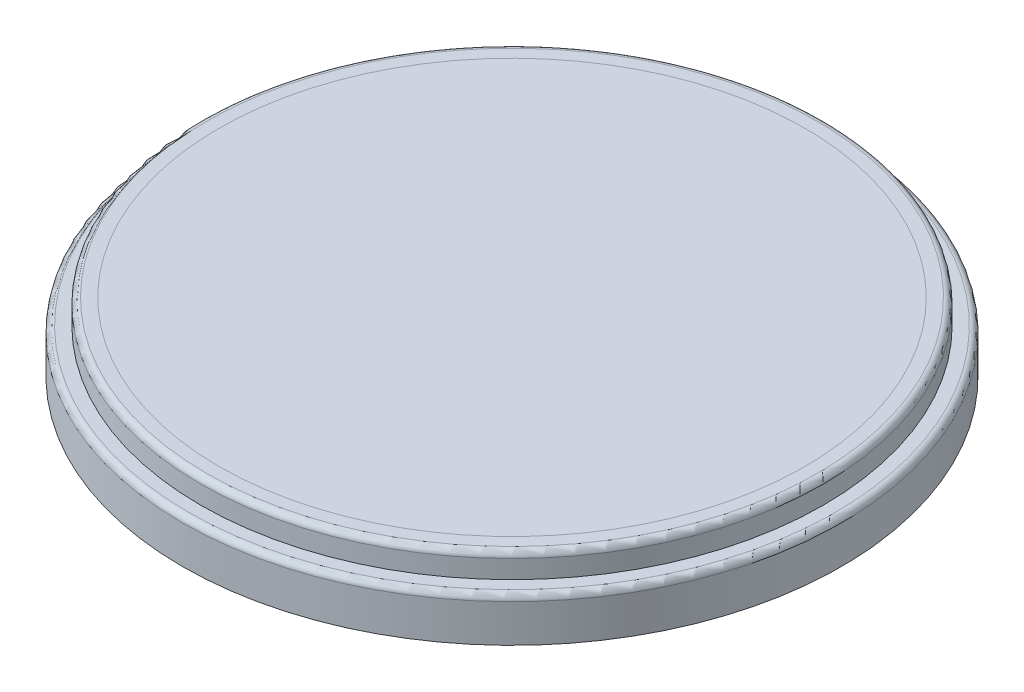
ISO-10303-21;
HEADER;
FILE_DESCRIPTION(('STEP AP214'),'2;1');
FILE_NAME('part.step','',(''),(''),'','','');
FILE_SCHEMA(('AUTOMOTIVE_DESIGN { 1 0 10303 214 1 1 1 1 }'));
ENDSEC;
DATA;
#1=APPLICATION_CONTEXT('core data for automotive mechanical design processes');
#2=APPLICATION_PROTOCOL_DEFINITION('international standard','automotive_design',2000,#1);
#3=PRODUCT_CONTEXT('',#1,'mechanical');
#4=PRODUCT('Part','Part','',(#3));
#5=PRODUCT_RELATED_PRODUCT_CATEGORY('part','',(#4));
#6=PRODUCT_DEFINITION_FORMATION('','',#4);
#7=PRODUCT_DEFINITION_CONTEXT('part definition',#1,'design');
#8=PRODUCT_DEFINITION('design','',#6,#7);
#9=PRODUCT_DEFINITION_SHAPE('','',#8);
#10=(LENGTH_UNIT() NAMED_UNIT(*) SI_UNIT(.MILLI.,.METRE.));
#11=(NAMED_UNIT(*) PLANE_ANGLE_UNIT() SI_UNIT($,.RADIAN.));
#12=(NAMED_UNIT(*) SI_UNIT($,.STERADIAN.) SOLID_ANGLE_UNIT());
#13=UNCERTAINTY_MEASURE_WITH_UNIT(LENGTH_MEASURE(1.E-05),#10,'distance_accuracy_value','');
#14=(GEOMETRIC_REPRESENTATION_CONTEXT(3) GLOBAL_UNCERTAINTY_ASSIGNED_CONTEXT((#13)) GLOBAL_UNIT_ASSIGNED_CONTEXT((#10,
#11,#12)) REPRESENTATION_CONTEXT('',''));
#15=CARTESIAN_POINT('',(0.,0.,0.));
#16=DIRECTION('',(0.,0.,1.));
#17=DIRECTION('',(1.,0.,0.));
#18=AXIS2_PLACEMENT_3D('',#15,#16,#17);
#19=CARTESIAN_POINT('',(0.,4.6,0.));
#20=DIRECTION('',(0.,1.,0.));
#21=DIRECTION('',(0.,0.,1.));
#22=AXIS2_PLACEMENT_3D('',#19,#20,#21);
#23=CYLINDRICAL_SURFACE('',#22,24.);
#24=CARTESIAN_POINT('',(0.,4.6,0.));
#25=DIRECTION('',(0.,1.,0.));
#26=DIRECTION('',(0.,0.,1.));
#27=AXIS2_PLACEMENT_3D('',#24,#25,#26);
#28=CIRCLE('',#27,24.);
#29=CARTESIAN_POINT('',(0.,4.6,24.));
#30=VERTEX_POINT('',#29);
#31=EDGE_CURVE('E11',#30,#30,#28,.T.);
#32=ORIENTED_EDGE('',*,*,#31,.T.);
#33=EDGE_LOOP('',(#32));
#34=FACE_BOUND('',#33,.T.);
#35=CARTESIAN_POINT('',(0.,5.6,0.));
#36=DIRECTION('',(0.,1.,0.));
#37=DIRECTION('',(0.,0.,1.));
#38=AXIS2_PLACEMENT_3D('',#35,#36,#37);
#39=CIRCLE('',#38,24.);
#40=CARTESIAN_POINT('',(0.,5.6,24.));
#41=VERTEX_POINT('',#40);
#42=EDGE_CURVE('E48',#41,#41,#39,.T.);
#43=ORIENTED_EDGE('',*,*,#42,.F.);
#44=EDGE_LOOP('',(#43));
#45=FACE_BOUND('',#44,.T.);
#46=ADVANCED_FACE('F45',(#34,#45),#23,.T.);
#47=CARTESIAN_POINT('',(0.,4.6,0.));
#48=DIRECTION('',(0.,1.,0.));
#49=DIRECTION('',(0.,0.,1.));
#50=AXIS2_PLACEMENT_3D('',#47,#48,#49);
#51=PLANE('',#50);
#52=ORIENTED_EDGE('',*,*,#31,.F.);
#53=EDGE_LOOP('',(#52));
#54=FACE_BOUND('',#53,.T.);
#55=ADVANCED_FACE('F60',(#54),#51,.F.);
#56=CARTESIAN_POINT('',(0.,5.6,0.));
#57=DIRECTION('',(0.,1.,0.));
#58=DIRECTION('',(0.,0.,1.));
#59=AXIS2_PLACEMENT_3D('',#56,#57,#58);
#60=PLANE('',#59);
#61=ORIENTED_EDGE('',*,*,#42,.T.);
#62=EDGE_LOOP('',(#61));
#63=FACE_BOUND('',#62,.T.);
#64=ADVANCED_FACE('F57',(#63),#60,.T.);
#65=CLOSED_SHELL('',(#46,#55,#64));
#66=MANIFOLD_SOLID_BREP('B2',#65);
#67=CARTESIAN_POINT('',(0.,5.6,0.));
#68=DIRECTION('',(0.,1.,0.));
#69=DIRECTION('',(0.,0.,1.));
#70=AXIS2_PLACEMENT_3D('',#67,#68,#69);
#71=PLANE('',#70);
#72=CARTESIAN_POINT('',(0.,5.6,0.));
#73=DIRECTION('',(0.,1.,0.));
#74=DIRECTION('',(0.,0.,1.));
#75=AXIS2_PLACEMENT_3D('',#72,#73,#74);
#76=CIRCLE('',#75,25.);
#77=CARTESIAN_POINT('',(0.,5.6,25.));
#78=VERTEX_POINT('',#77);
#79=EDGE_CURVE('E100',#78,#78,#76,.T.);
#80=ORIENTED_EDGE('',*,*,#79,.T.);
#81=EDGE_LOOP('',(#80));
#82=FACE_BOUND('',#81,.T.);
#83=CARTESIAN_POINT('',(0.,5.6,0.));
#84=DIRECTION('',(0.,1.,0.));
#85=DIRECTION('',(0.,0.,1.));
#86=AXIS2_PLACEMENT_3D('',#83,#84,#85);
#87=CIRCLE('',#86,24.);
#88=CARTESIAN_POINT('',(0.,5.6,24.));
#89=VERTEX_POINT('',#88);
#90=EDGE_CURVE('E116',#89,#89,#87,.T.);
#91=ORIENTED_EDGE('',*,*,#90,.F.);
#92=EDGE_LOOP('',(#91));
#93=FACE_BOUND('',#92,.T.);
#94=ADVANCED_FACE('F93',(#82,#93),#71,.T.);
#95=CARTESIAN_POINT('',(0.,3.6,0.));
#96=DIRECTION('',(0.,1.,0.));
#97=DIRECTION('',(0.,0.,1.));
#98=AXIS2_PLACEMENT_3D('',#95,#96,#97);
#99=PLANE('',#98);
#100=CARTESIAN_POINT('',(0.,3.6,0.));
#101=DIRECTION('',(0.,1.,0.));
#102=DIRECTION('',(0.,0.,1.));
#103=AXIS2_PLACEMENT_3D('',#100,#101,#102);
#104=CIRCLE('',#103,24.5);
#105=CARTESIAN_POINT('',(0.,3.6,24.5));
#106=VERTEX_POINT('',#105);
#107=EDGE_CURVE('E108',#106,#106,#104,.T.);
#108=ORIENTED_EDGE('',*,*,#107,.T.);
#109=EDGE_LOOP('',(#108));
#110=FACE_BOUND('',#109,.T.);
#111=CARTESIAN_POINT('',(0.,3.6,0.));
#112=DIRECTION('',(0.,1.,0.));
#113=DIRECTION('',(0.,0.,1.));
#114=AXIS2_PLACEMENT_3D('',#111,#112,#113);
#115=CIRCLE('',#114,25.5);
#116=CARTESIAN_POINT('',(0.,3.6,25.5));
#117=VERTEX_POINT('',#116);
#118=EDGE_CURVE('E113',#117,#117,#115,.T.);
#119=ORIENTED_EDGE('',*,*,#118,.F.);
#120=EDGE_LOOP('',(#119));
#121=FACE_BOUND('',#120,.T.);
#122=ADVANCED_FACE('F123',(#110,#121),#99,.F.);
#123=CARTESIAN_POINT('',(0.,5.6,0.));
#124=DIRECTION('',(0.,-1.,0.));
#125=DIRECTION('',(0.,0.,-1.));
#126=AXIS2_PLACEMENT_3D('',#123,#124,#125);
#127=CYLINDRICAL_SURFACE('',#126,25.5);
#128=CARTESIAN_POINT('',(0.,5.1,0.));
#129=DIRECTION('',(0.,1.,0.));
#130=DIRECTION('',(0.,0.,1.));
#131=AXIS2_PLACEMENT_3D('',#128,#129,#130);
#132=CIRCLE('',#131,25.5);
#133=CARTESIAN_POINT('',(0.,5.1,25.5));
#134=VERTEX_POINT('',#133);
#135=EDGE_CURVE('E44',#134,#134,#132,.F.);
#136=ORIENTED_EDGE('',*,*,#135,.T.);
#137=EDGE_LOOP('',(#136));
#138=FACE_BOUND('',#137,.T.);
#139=ORIENTED_EDGE('',*,*,#118,.T.);
#140=EDGE_LOOP('',(#139));
#141=FACE_BOUND('',#140,.T.);
#142=ADVANCED_FACE('F128',(#138,#141),#127,.T.);
#143=CARTESIAN_POINT('',(0.,5.6,0.));
#144=DIRECTION('',(0.,-1.,0.));
#145=DIRECTION('',(0.,0.,-1.));
#146=AXIS2_PLACEMENT_3D('',#143,#144,#145);
#147=CYLINDRICAL_SURFACE('',#146,24.);
#148=CARTESIAN_POINT('',(0.,4.1,0.));
#149=DIRECTION('',(0.,1.,0.));
#150=DIRECTION('',(0.,0.,1.));
#151=AXIS2_PLACEMENT_3D('',#148,#149,#150);
#152=CIRCLE('',#151,24.);
#153=CARTESIAN_POINT('',(0.,4.1,24.));
#154=VERTEX_POINT('',#153);
#155=EDGE_CURVE('E104',#154,#154,#152,.F.);
#156=ORIENTED_EDGE('',*,*,#155,.T.);
#157=EDGE_LOOP('',(#156));
#158=FACE_BOUND('',#157,.T.);
#159=ORIENTED_EDGE('',*,*,#90,.T.);
#160=EDGE_LOOP('',(#159));
#161=FACE_BOUND('',#160,.T.);
#162=ADVANCED_FACE('F120',(#158,#161),#147,.F.);
#163=CARTESIAN_POINT('',(0.,4.1,0.));
#164=DIRECTION('',(0.,1.,0.));
#165=DIRECTION('',(0.,0.,1.));
#166=AXIS2_PLACEMENT_3D('',#163,#164,#165);
#167=TOROIDAL_SURFACE('',#166,24.5,0.5);
#168=ORIENTED_EDGE('',*,*,#155,.F.);
#169=EDGE_LOOP('',(#168));
#170=FACE_BOUND('',#169,.T.);
#171=ORIENTED_EDGE('',*,*,#107,.F.);
#172=EDGE_LOOP('',(#171));
#173=FACE_BOUND('',#172,.T.);
#174=ADVANCED_FACE('F134',(#170,#173),#167,.T.);
#175=CARTESIAN_POINT('',(0.,5.1,0.));
#176=DIRECTION('',(0.,1.,0.));
#177=DIRECTION('',(0.,0.,1.));
#178=AXIS2_PLACEMENT_3D('',#175,#176,#177);
#179=TOROIDAL_SURFACE('',#178,25.,0.5);
#180=ORIENTED_EDGE('',*,*,#135,.F.);
#181=EDGE_LOOP('',(#180));
#182=FACE_BOUND('',#181,.T.);
#183=ORIENTED_EDGE('',*,*,#79,.F.);
#184=EDGE_LOOP('',(#183));
#185=FACE_BOUND('',#184,.T.);
#186=ADVANCED_FACE('F95',(#182,#185),#179,.T.);
#187=CLOSED_SHELL('',(#94,#122,#142,#162,#174,#186));
#188=MANIFOLD_SOLID_BREP('B6',#187);
#189=CARTESIAN_POINT('',(0.,3.6,0.));
#190=DIRECTION('',(0.,1.,0.));
#191=DIRECTION('',(0.,0.,1.));
#192=AXIS2_PLACEMENT_3D('',#189,#190,#191);
#193=PLANE('',#192);
#194=CARTESIAN_POINT('',(0.,3.6,0.));
#195=DIRECTION('',(0.,1.,0.));
#196=DIRECTION('',(0.,0.,1.));
#197=AXIS2_PLACEMENT_3D('',#194,#195,#196);
#198=CIRCLE('',#197,26.5);
#199=CARTESIAN_POINT('',(0.,3.6,26.5));
#200=VERTEX_POINT('',#199);
#201=EDGE_CURVE('E191',#200,#200,#198,.T.);
#202=ORIENTED_EDGE('',*,*,#201,.T.);
#203=EDGE_LOOP('',(#202));
#204=FACE_BOUND('',#203,.T.);
#205=CARTESIAN_POINT('',(0.,3.6,0.));
#206=DIRECTION('',(0.,1.,0.));
#207=DIRECTION('',(0.,0.,1.));
#208=AXIS2_PLACEMENT_3D('',#205,#206,#207);
#209=CIRCLE('',#208,25.5);
#210=CARTESIAN_POINT('',(0.,3.6,25.5));
#211=VERTEX_POINT('',#210);
#212=EDGE_CURVE('E199',#211,#211,#209,.T.);
#213=ORIENTED_EDGE('',*,*,#212,.F.);
#214=EDGE_LOOP('',(#213));
#215=FACE_BOUND('',#214,.T.);
#216=ADVANCED_FACE('F184',(#204,#215),#193,.T.);
#217=CARTESIAN_POINT('',(0.,0.,0.));
#218=DIRECTION('',(0.,1.,0.));
#219=DIRECTION('',(0.,0.,1.));
#220=AXIS2_PLACEMENT_3D('',#217,#218,#219);
#221=PLANE('',#220);
#222=CARTESIAN_POINT('',(0.,0.,0.));
#223=DIRECTION('',(0.,1.,0.));
#224=DIRECTION('',(0.,0.,1.));
#225=AXIS2_PLACEMENT_3D('',#222,#223,#224);
#226=CIRCLE('',#225,27.);
#227=CARTESIAN_POINT('',(0.,0.,27.));
#228=VERTEX_POINT('',#227);
#229=EDGE_CURVE('E195',#228,#228,#226,.T.);
#230=ORIENTED_EDGE('',*,*,#229,.F.);
#231=EDGE_LOOP('',(#230));
#232=FACE_BOUND('',#231,.T.);
#233=CARTESIAN_POINT('',(0.,0.,0.));
#234=DIRECTION('',(0.,1.,0.));
#235=DIRECTION('',(0.,0.,1.));
#236=AXIS2_PLACEMENT_3D('',#233,#234,#235);
#237=CIRCLE('',#236,25.5);
#238=CARTESIAN_POINT('',(0.,0.,25.5));
#239=VERTEX_POINT('',#238);
#240=EDGE_CURVE('E202',#239,#239,#237,.T.);
#241=ORIENTED_EDGE('',*,*,#240,.T.);
#242=EDGE_LOOP('',(#241));
#243=FACE_BOUND('',#242,.T.);
#244=ADVANCED_FACE('F212',(#232,#243),#221,.F.);
#245=CARTESIAN_POINT('',(0.,3.6,0.));
#246=DIRECTION('',(0.,-1.,0.));
#247=DIRECTION('',(0.,0.,-1.));
#248=AXIS2_PLACEMENT_3D('',#245,#246,#247);
#249=CYLINDRICAL_SURFACE('',#248,27.);
#250=CARTESIAN_POINT('',(0.,3.1,0.));
#251=DIRECTION('',(0.,1.,0.));
#252=DIRECTION('',(0.,0.,1.));
#253=AXIS2_PLACEMENT_3D('',#250,#251,#252);
#254=CIRCLE('',#253,27.);
#255=CARTESIAN_POINT('',(0.,3.1,27.));
#256=VERTEX_POINT('',#255);
#257=EDGE_CURVE('E92',#256,#256,#254,.F.);
#258=ORIENTED_EDGE('',*,*,#257,.T.);
#259=EDGE_LOOP('',(#258));
#260=FACE_BOUND('',#259,.T.);
#261=ORIENTED_EDGE('',*,*,#229,.T.);
#262=EDGE_LOOP('',(#261));
#263=FACE_BOUND('',#262,.T.);
#264=ADVANCED_FACE('F217',(#260,#263),#249,.T.);
#265=CARTESIAN_POINT('',(0.,3.6,0.));
#266=DIRECTION('',(0.,-1.,0.));
#267=DIRECTION('',(0.,0.,-1.));
#268=AXIS2_PLACEMENT_3D('',#265,#266,#267);
#269=CYLINDRICAL_SURFACE('',#268,25.5);
#270=ORIENTED_EDGE('',*,*,#212,.T.);
#271=EDGE_LOOP('',(#270));
#272=FACE_BOUND('',#271,.T.);
#273=ORIENTED_EDGE('',*,*,#240,.F.);
#274=EDGE_LOOP('',(#273));
#275=FACE_BOUND('',#274,.T.);
#276=ADVANCED_FACE('F208',(#272,#275),#269,.F.);
#277=CARTESIAN_POINT('',(0.,3.1,0.));
#278=DIRECTION('',(0.,1.,0.));
#279=DIRECTION('',(0.,0.,1.));
#280=AXIS2_PLACEMENT_3D('',#277,#278,#279);
#281=TOROIDAL_SURFACE('',#280,26.5,0.5);
#282=ORIENTED_EDGE('',*,*,#257,.F.);
#283=EDGE_LOOP('',(#282));
#284=FACE_BOUND('',#283,.T.);
#285=ORIENTED_EDGE('',*,*,#201,.F.);
#286=EDGE_LOOP('',(#285));
#287=FACE_BOUND('',#286,.T.);
#288=ADVANCED_FACE('F186',(#284,#287),#281,.T.);
#289=CLOSED_SHELL('',(#216,#244,#264,#276,#288));
#290=MANIFOLD_SOLID_BREP('B39',#289);
#291=ADVANCED_BREP_SHAPE_REPRESENTATION('',(#18,#66,#188,#290),#14);
#292=SHAPE_DEFINITION_REPRESENTATION(#9,#291);
ENDSEC;
END-ISO-10303-21;
